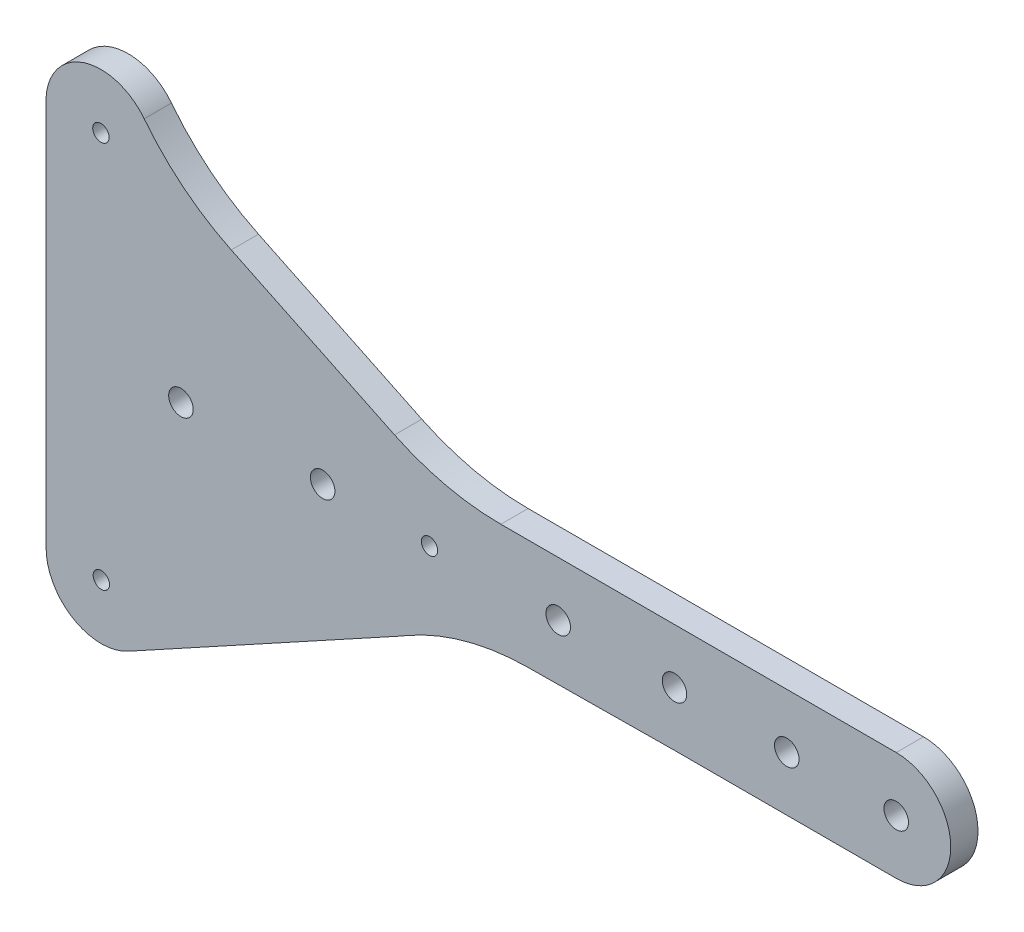
ISO-10303-21;
HEADER;
FILE_DESCRIPTION(('STEP AP214'),'2;1');
FILE_NAME('part.step','',(''),(''),'','','');
FILE_SCHEMA(('AUTOMOTIVE_DESIGN { 1 0 10303 214 1 1 1 1 }'));
ENDSEC;
DATA;
#1=APPLICATION_CONTEXT('core data for automotive mechanical design processes');
#2=APPLICATION_PROTOCOL_DEFINITION('international standard','automotive_design',2000,#1);
#3=PRODUCT_CONTEXT('',#1,'mechanical');
#4=PRODUCT('Part','Part','',(#3));
#5=PRODUCT_RELATED_PRODUCT_CATEGORY('part','',(#4));
#6=PRODUCT_DEFINITION_FORMATION('','',#4);
#7=PRODUCT_DEFINITION_CONTEXT('part definition',#1,'design');
#8=PRODUCT_DEFINITION('design','',#6,#7);
#9=PRODUCT_DEFINITION_SHAPE('','',#8);
#10=(LENGTH_UNIT() NAMED_UNIT(*) SI_UNIT(.MILLI.,.METRE.));
#11=(NAMED_UNIT(*) PLANE_ANGLE_UNIT() SI_UNIT($,.RADIAN.));
#12=(NAMED_UNIT(*) SI_UNIT($,.STERADIAN.) SOLID_ANGLE_UNIT());
#13=UNCERTAINTY_MEASURE_WITH_UNIT(LENGTH_MEASURE(1.E-05),#10,'distance_accuracy_value','');
#14=(GEOMETRIC_REPRESENTATION_CONTEXT(3) GLOBAL_UNCERTAINTY_ASSIGNED_CONTEXT((#13)) GLOBAL_UNIT_ASSIGNED_CONTEXT((#10,
#11,#12)) REPRESENTATION_CONTEXT('',''));
#15=CARTESIAN_POINT('',(0.,0.,0.));
#16=DIRECTION('',(0.,0.,1.));
#17=DIRECTION('',(1.,0.,0.));
#18=AXIS2_PLACEMENT_3D('',#15,#16,#17);
#19=CARTESIAN_POINT('',(15.4,-35.5,5.));
#20=DIRECTION('',(0.,0.,-1.));
#21=DIRECTION('',(-1.,0.,0.));
#22=AXIS2_PLACEMENT_3D('',#19,#20,#21);
#23=CYLINDRICAL_SURFACE('',#22,10.1327105129006);
#24=CARTESIAN_POINT('',(15.4,-35.4999999999999,0.));
#25=DIRECTION('',(0.,0.,-1.));
#26=DIRECTION('',(-1.,0.,0.));
#27=AXIS2_PLACEMENT_3D('',#24,#25,#26);
#28=CIRCLE('',#27,10.1327105129006);
#29=CARTESIAN_POINT('',(20.2700398860927,-44.3856363782293,0.));
#30=VERTEX_POINT('',#29);
#31=CARTESIAN_POINT('',(5.2672894870994,-35.5,0.));
#32=VERTEX_POINT('',#31);
#33=EDGE_CURVE('E176',#30,#32,#28,.T.);
#34=ORIENTED_EDGE('',*,*,#33,.F.);
#35=DIRECTION('',(0.,0.,-1.));
#36=VECTOR('',#35,1.);
#37=CARTESIAN_POINT('',(20.2700398860927,-44.3856363782293,5.));
#38=LINE('',#37,#36);
#39=CARTESIAN_POINT('',(20.2700398860927,-44.3856363782293,5.));
#40=VERTEX_POINT('',#39);
#41=EDGE_CURVE('E13',#40,#30,#38,.T.);
#42=ORIENTED_EDGE('',*,*,#41,.F.);
#43=CARTESIAN_POINT('',(15.4,-35.5,5.));
#44=DIRECTION('',(0.,0.,-1.));
#45=DIRECTION('',(-1.,0.,0.));
#46=AXIS2_PLACEMENT_3D('',#43,#44,#45);
#47=CIRCLE('',#46,10.1327105129006);
#48=CARTESIAN_POINT('',(5.2672894870994,-35.5,5.));
#49=VERTEX_POINT('',#48);
#50=EDGE_CURVE('E212',#40,#49,#47,.T.);
#51=ORIENTED_EDGE('',*,*,#50,.T.);
#52=DIRECTION('',(0.,0.,-1.));
#53=VECTOR('',#52,1.);
#54=CARTESIAN_POINT('',(5.2672894870994,-35.5,5.));
#55=LINE('',#54,#53);
#56=EDGE_CURVE('E51',#49,#32,#55,.T.);
#57=ORIENTED_EDGE('',*,*,#56,.T.);
#58=EDGE_LOOP('',(#34,#42,#51,#57));
#59=FACE_BOUND('',#58,.T.);
#60=ADVANCED_FACE('F48',(#59),#23,.T.);
#61=CARTESIAN_POINT('',(20.2700398860927,-44.3856363782293,5.));
#62=DIRECTION('',(0.48062558186108,-0.876925909105609,0.));
#63=DIRECTION('',(0.876925909105609,0.48062558186108,0.));
#64=AXIS2_PLACEMENT_3D('',#61,#62,#63);
#65=PLANE('',#64);
#66=DIRECTION('',(-0.876925909105609,-0.48062558186108,0.));
#67=VECTOR('',#66,1.);
#68=CARTESIAN_POINT('',(20.2700398860927,-44.3856363782293,0.));
#69=LINE('',#68,#67);
#70=CARTESIAN_POINT('',(70.419428585343,-16.8997577272749,0.));
#71=VERTEX_POINT('',#70);
#72=EDGE_CURVE('E210',#71,#30,#69,.T.);
#73=ORIENTED_EDGE('',*,*,#72,.F.);
#74=DIRECTION('',(0.,0.,-1.));
#75=VECTOR('',#74,1.);
#76=CARTESIAN_POINT('',(70.419428585343,-16.8997577272749,5.));
#77=LINE('',#76,#75);
#78=CARTESIAN_POINT('',(70.419428585343,-16.8997577272749,5.));
#79=VERTEX_POINT('',#78);
#80=EDGE_CURVE('E57',#79,#71,#77,.T.);
#81=ORIENTED_EDGE('',*,*,#80,.F.);
#82=DIRECTION('',(-0.876925909105609,-0.48062558186108,0.));
#83=VECTOR('',#82,1.);
#84=CARTESIAN_POINT('',(20.2700398860927,-44.3856363782293,5.));
#85=LINE('',#84,#83);
#86=EDGE_CURVE('E166',#79,#40,#85,.T.);
#87=ORIENTED_EDGE('',*,*,#86,.T.);
#88=ORIENTED_EDGE('',*,*,#41,.T.);
#89=EDGE_LOOP('',(#73,#81,#87,#88));
#90=FACE_BOUND('',#89,.T.);
#91=ADVANCED_FACE('F236',(#90),#65,.T.);
#92=CARTESIAN_POINT('',(71.3410403775092,-16.3633569679973,4.99999999999999));
#93=DIRECTION('',(0.503026872738356,-0.864270770825365,0.));
#94=DIRECTION('',(0.864270770825365,0.503026872738356,0.));
#95=AXIS2_PLACEMENT_3D('',#92,#93,#94);
#96=PLANE('',#95);
#97=DIRECTION('',(-0.864270770825365,-0.503026872738356,0.));
#98=VECTOR('',#97,1.);
#99=CARTESIAN_POINT('',(71.3410403775092,-16.3633569679973,0.));
#100=LINE('',#99,#98);
#101=CARTESIAN_POINT('',(71.3410403775092,-16.3633569679973,0.));
#102=VERTEX_POINT('',#101);
#103=EDGE_CURVE('E152',#102,#71,#100,.T.);
#104=ORIENTED_EDGE('',*,*,#103,.F.);
#105=DIRECTION('',(0.,0.,-1.));
#106=VECTOR('',#105,1.);
#107=CARTESIAN_POINT('',(71.3410403775092,-16.3633569679973,4.99999999999999));
#108=LINE('',#107,#106);
#109=CARTESIAN_POINT('',(71.3410403775092,-16.3633569679973,4.99999999999999));
#110=VERTEX_POINT('',#109);
#111=EDGE_CURVE('E147',#110,#102,#108,.T.);
#112=ORIENTED_EDGE('',*,*,#111,.F.);
#113=DIRECTION('',(-0.864270770825365,-0.503026872738356,0.));
#114=VECTOR('',#113,1.);
#115=CARTESIAN_POINT('',(71.3410403775092,-16.3633569679973,4.99999999999999));
#116=LINE('',#115,#114);
#117=EDGE_CURVE('E150',#110,#79,#116,.T.);
#118=ORIENTED_EDGE('',*,*,#117,.T.);
#119=ORIENTED_EDGE('',*,*,#80,.T.);
#120=EDGE_LOOP('',(#104,#112,#118,#119));
#121=FACE_BOUND('',#120,.T.);
#122=ADVANCED_FACE('F149',(#121),#96,.T.);
#123=CARTESIAN_POINT('',(93.9772496507354,-55.2555416551387,5.));
#124=DIRECTION('',(0.,0.,-1.));
#125=DIRECTION('',(-1.,0.,0.));
#126=AXIS2_PLACEMENT_3D('',#123,#124,#125);
#127=CYLINDRICAL_SURFACE('',#126,45.);
#128=CARTESIAN_POINT('',(93.9772496507354,-55.2555416551386,0.));
#129=DIRECTION('',(0.,0.,1.));
#130=DIRECTION('',(1.,0.,0.));
#131=AXIS2_PLACEMENT_3D('',#128,#129,#130);
#132=CIRCLE('',#131,45.);
#133=CARTESIAN_POINT('',(93.547882820936,-10.2575901003682,0.));
#134=VERTEX_POINT('',#133);
#135=EDGE_CURVE('E207',#134,#102,#132,.T.);
#136=ORIENTED_EDGE('',*,*,#135,.F.);
#137=DIRECTION('',(0.,0.,-1.));
#138=VECTOR('',#137,1.);
#139=CARTESIAN_POINT('',(93.547882820936,-10.2575901003682,4.99999999999999));
#140=LINE('',#139,#138);
#141=CARTESIAN_POINT('',(93.547882820936,-10.2575901003682,4.99999999999999));
#142=VERTEX_POINT('',#141);
#143=EDGE_CURVE('E157',#142,#134,#140,.T.);
#144=ORIENTED_EDGE('',*,*,#143,.F.);
#145=CARTESIAN_POINT('',(93.9772496507354,-55.2555416551387,5.));
#146=DIRECTION('',(0.,0.,1.));
#147=DIRECTION('',(1.,0.,0.));
#148=AXIS2_PLACEMENT_3D('',#145,#146,#147);
#149=CIRCLE('',#148,45.);
#150=EDGE_CURVE('E164',#142,#110,#149,.T.);
#151=ORIENTED_EDGE('',*,*,#150,.T.);
#152=ORIENTED_EDGE('',*,*,#111,.T.);
#153=EDGE_LOOP('',(#136,#144,#151,#152));
#154=FACE_BOUND('',#153,.T.);
#155=ADVANCED_FACE('F168',(#154),#127,.F.);
#156=CARTESIAN_POINT('',(120.543509993257,-9.99999999999837,5.));
#157=DIRECTION('',(0.00954148510665591,-0.999954478994899,0.));
#158=DIRECTION('',(0.999954478994899,0.00954148510665591,0.));
#159=AXIS2_PLACEMENT_3D('',#156,#157,#158);
#160=PLANE('',#159);
#161=DIRECTION('',(-0.999954478994899,-0.00954148510665591,0.));
#162=VECTOR('',#161,1.);
#163=CARTESIAN_POINT('',(120.543509993257,-9.99999999999837,0.));
#164=LINE('',#163,#162);
#165=CARTESIAN_POINT('',(120.543509993257,-9.99999999999837,0.));
#166=VERTEX_POINT('',#165);
#167=EDGE_CURVE('E204',#166,#134,#164,.T.);
#168=ORIENTED_EDGE('',*,*,#167,.F.);
#169=DIRECTION('',(0.,0.,-1.));
#170=VECTOR('',#169,1.);
#171=CARTESIAN_POINT('',(120.543509993257,-9.99999999999837,5.));
#172=LINE('',#171,#170);
#173=CARTESIAN_POINT('',(120.543509993257,-9.99999999999837,5.));
#174=VERTEX_POINT('',#173);
#175=EDGE_CURVE('E216',#174,#166,#172,.T.);
#176=ORIENTED_EDGE('',*,*,#175,.F.);
#177=DIRECTION('',(-0.999954478994899,-0.00954148510665591,0.));
#178=VECTOR('',#177,1.);
#179=CARTESIAN_POINT('',(120.543509993257,-9.99999999999837,5.));
#180=LINE('',#179,#178);
#181=EDGE_CURVE('E169',#174,#142,#180,.T.);
#182=ORIENTED_EDGE('',*,*,#181,.T.);
#183=ORIENTED_EDGE('',*,*,#143,.T.);
#184=EDGE_LOOP('',(#168,#176,#182,#183));
#185=FACE_BOUND('',#184,.T.);
#186=ADVANCED_FACE('F249',(#185),#160,.T.);
#187=CARTESIAN_POINT('',(120.543509993257,-9.99999999999837,5.));
#188=DIRECTION('',(0.,-1.,0.));
#189=DIRECTION('',(0.,0.,-1.));
#190=AXIS2_PLACEMENT_3D('',#187,#188,#189);
#191=PLANE('',#190);
#192=DIRECTION('',(-1.,0.,0.));
#193=VECTOR('',#192,1.);
#194=CARTESIAN_POINT('',(120.543509993257,-9.99999999999837,0.));
#195=LINE('',#194,#193);
#196=CARTESIAN_POINT('',(161.221070033097,-9.99999999999837,0.));
#197=VERTEX_POINT('',#196);
#198=EDGE_CURVE('E201',#197,#166,#195,.T.);
#199=ORIENTED_EDGE('',*,*,#198,.F.);
#200=DIRECTION('',(0.,0.,-1.));
#201=VECTOR('',#200,1.);
#202=CARTESIAN_POINT('',(161.221070033097,-9.9999999999984,5.));
#203=LINE('',#202,#201);
#204=CARTESIAN_POINT('',(161.221070033097,-9.9999999999984,5.));
#205=VERTEX_POINT('',#204);
#206=EDGE_CURVE('E218',#205,#197,#203,.T.);
#207=ORIENTED_EDGE('',*,*,#206,.F.);
#208=DIRECTION('',(-1.,0.,0.));
#209=VECTOR('',#208,1.);
#210=CARTESIAN_POINT('',(120.543509993257,-9.99999999999837,5.));
#211=LINE('',#210,#209);
#212=EDGE_CURVE('E171',#205,#174,#211,.T.);
#213=ORIENTED_EDGE('',*,*,#212,.T.);
#214=ORIENTED_EDGE('',*,*,#175,.T.);
#215=EDGE_LOOP('',(#199,#207,#213,#214));
#216=FACE_BOUND('',#215,.T.);
#217=ADVANCED_FACE('F252',(#216),#191,.T.);
#218=CARTESIAN_POINT('',(161.221070033097,1.18394877235417E-12,5.));
#219=DIRECTION('',(0.,0.,-1.));
#220=DIRECTION('',(-1.,0.,0.));
#221=AXIS2_PLACEMENT_3D('',#218,#219,#220);
#222=CYLINDRICAL_SURFACE('',#221,9.99999999999956);
#223=CARTESIAN_POINT('',(161.221070033097,1.18264772974719E-12,0.));
#224=DIRECTION('',(0.,0.,-1.));
#225=DIRECTION('',(-1.,0.,0.));
#226=AXIS2_PLACEMENT_3D('',#223,#224,#225);
#227=CIRCLE('',#226,9.99999999999956);
#228=CARTESIAN_POINT('',(161.221070033097,10.0000000000007,0.));
#229=VERTEX_POINT('',#228);
#230=EDGE_CURVE('E198',#229,#197,#227,.T.);
#231=ORIENTED_EDGE('',*,*,#230,.F.);
#232=DIRECTION('',(0.,0.,-1.));
#233=VECTOR('',#232,1.);
#234=CARTESIAN_POINT('',(161.221070033097,10.0000000000007,4.99999999999998));
#235=LINE('',#234,#233);
#236=CARTESIAN_POINT('',(161.221070033097,10.0000000000007,4.99999999999998));
#237=VERTEX_POINT('',#236);
#238=EDGE_CURVE('E220',#237,#229,#235,.T.);
#239=ORIENTED_EDGE('',*,*,#238,.F.);
#240=CARTESIAN_POINT('',(161.221070033097,1.18394877235417E-12,5.));
#241=DIRECTION('',(0.,0.,-1.));
#242=DIRECTION('',(-1.,0.,0.));
#243=AXIS2_PLACEMENT_3D('',#240,#241,#242);
#244=CIRCLE('',#243,9.99999999999956);
#245=EDGE_CURVE('E403',#237,#205,#244,.T.);
#246=ORIENTED_EDGE('',*,*,#245,.T.);
#247=ORIENTED_EDGE('',*,*,#206,.T.);
#248=EDGE_LOOP('',(#231,#239,#246,#247));
#249=FACE_BOUND('',#248,.T.);
#250=ADVANCED_FACE('F256',(#249),#222,.T.);
#251=CARTESIAN_POINT('',(120.543509993257,10.0000000000007,4.99999999999998));
#252=DIRECTION('',(0.,1.,0.));
#253=DIRECTION('',(0.,0.,1.));
#254=AXIS2_PLACEMENT_3D('',#251,#252,#253);
#255=PLANE('',#254);
#256=DIRECTION('',(1.,0.,0.));
#257=VECTOR('',#256,1.);
#258=CARTESIAN_POINT('',(120.543509993257,10.0000000000007,0.));
#259=LINE('',#258,#257);
#260=CARTESIAN_POINT('',(88.6858525505972,10.0000000000007,0.));
#261=VERTEX_POINT('',#260);
#262=EDGE_CURVE('E195',#261,#229,#259,.T.);
#263=ORIENTED_EDGE('',*,*,#262,.F.);
#264=DIRECTION('',(0.,0.,-1.));
#265=VECTOR('',#264,1.);
#266=CARTESIAN_POINT('',(88.6858525505972,10.0000000000007,4.99999999999998));
#267=LINE('',#266,#265);
#268=CARTESIAN_POINT('',(88.6858525505972,10.0000000000007,4.99999999999998));
#269=VERTEX_POINT('',#268);
#270=EDGE_CURVE('E222',#269,#261,#267,.T.);
#271=ORIENTED_EDGE('',*,*,#270,.F.);
#272=DIRECTION('',(1.,0.,0.));
#273=VECTOR('',#272,1.);
#274=CARTESIAN_POINT('',(88.6858525505972,10.0000000000007,4.99999999999998));
#275=LINE('',#274,#273);
#276=EDGE_CURVE('E401',#269,#237,#275,.T.);
#277=ORIENTED_EDGE('',*,*,#276,.T.);
#278=ORIENTED_EDGE('',*,*,#238,.T.);
#279=EDGE_LOOP('',(#263,#271,#277,#278));
#280=FACE_BOUND('',#279,.T.);
#281=ADVANCED_FACE('F260',(#280),#255,.T.);
#282=CARTESIAN_POINT('',(88.685852550597,55.0000000000007,5.));
#283=DIRECTION('',(0.,0.,-1.));
#284=DIRECTION('',(-1.,0.,0.));
#285=AXIS2_PLACEMENT_3D('',#282,#283,#284);
#286=CYLINDRICAL_SURFACE('',#285,45.);
#287=CARTESIAN_POINT('',(88.685852550597,55.0000000000008,0.));
#288=DIRECTION('',(0.,0.,1.));
#289=DIRECTION('',(1.,0.,0.));
#290=AXIS2_PLACEMENT_3D('',#287,#288,#289);
#291=CIRCLE('',#290,45.);
#292=CARTESIAN_POINT('',(69.1842635861553,14.4452465441854,0.));
#293=VERTEX_POINT('',#292);
#294=EDGE_CURVE('E192',#293,#261,#291,.T.);
#295=ORIENTED_EDGE('',*,*,#294,.F.);
#296=DIRECTION('',(0.,0.,-1.));
#297=VECTOR('',#296,1.);
#298=CARTESIAN_POINT('',(69.1842635861553,14.4452465441854,5.));
#299=LINE('',#298,#297);
#300=CARTESIAN_POINT('',(69.1842635861553,14.4452465441854,5.));
#301=VERTEX_POINT('',#300);
#302=EDGE_CURVE('E225',#301,#293,#299,.T.);
#303=ORIENTED_EDGE('',*,*,#302,.F.);
#304=CARTESIAN_POINT('',(88.685852550597,55.0000000000007,5.));
#305=DIRECTION('',(0.,0.,1.));
#306=DIRECTION('',(1.,0.,0.));
#307=AXIS2_PLACEMENT_3D('',#304,#305,#306);
#308=CIRCLE('',#307,45.);
#309=EDGE_CURVE('E398',#301,#269,#308,.T.);
#310=ORIENTED_EDGE('',*,*,#309,.T.);
#311=ORIENTED_EDGE('',*,*,#270,.T.);
#312=EDGE_LOOP('',(#295,#303,#310,#311));
#313=FACE_BOUND('',#312,.T.);
#314=ADVANCED_FACE('F264',(#313),#286,.F.);
#315=CARTESIAN_POINT('',(39.2255189041701,28.8515263238237,5.));
#316=DIRECTION('',(0.433368643654258,0.901216743462564,0.));
#317=DIRECTION('',(-0.901216743462564,0.433368643654258,0.));
#318=AXIS2_PLACEMENT_3D('',#315,#316,#317);
#319=PLANE('',#318);
#320=DIRECTION('',(0.901216743462564,-0.433368643654258,0.));
#321=VECTOR('',#320,1.);
#322=CARTESIAN_POINT('',(39.2255189041701,28.8515263238237,0.));
#323=LINE('',#322,#321);
#324=CARTESIAN_POINT('',(39.2255189041701,28.8515263238237,0.));
#325=VERTEX_POINT('',#324);
#326=EDGE_CURVE('E189',#325,#293,#323,.T.);
#327=ORIENTED_EDGE('',*,*,#326,.F.);
#328=DIRECTION('',(0.,0.,-1.));
#329=VECTOR('',#328,1.);
#330=CARTESIAN_POINT('',(39.2255189041701,28.8515263238237,5.));
#331=LINE('',#330,#329);
#332=CARTESIAN_POINT('',(39.2255189041701,28.8515263238237,5.));
#333=VERTEX_POINT('',#332);
#334=EDGE_CURVE('E227',#333,#325,#331,.T.);
#335=ORIENTED_EDGE('',*,*,#334,.F.);
#336=DIRECTION('',(0.901216743462564,-0.433368643654258,0.));
#337=VECTOR('',#336,1.);
#338=CARTESIAN_POINT('',(39.2255189041701,28.8515263238237,5.));
#339=LINE('',#338,#337);
#340=EDGE_CURVE('E395',#333,#301,#339,.T.);
#341=ORIENTED_EDGE('',*,*,#340,.T.);
#342=ORIENTED_EDGE('',*,*,#302,.T.);
#343=EDGE_LOOP('',(#327,#335,#341,#342));
#344=FACE_BOUND('',#343,.T.);
#345=ADVANCED_FACE('F268',(#344),#319,.T.);
#346=CARTESIAN_POINT('',(58.7271078686117,69.406279779639,5.));
#347=DIRECTION('',(0.,0.,-1.));
#348=DIRECTION('',(-1.,0.,0.));
#349=AXIS2_PLACEMENT_3D('',#346,#347,#348);
#350=CYLINDRICAL_SURFACE('',#349,45.);
#351=CARTESIAN_POINT('',(58.7271078686117,69.406279779639,0.));
#352=DIRECTION('',(0.,0.,1.));
#353=DIRECTION('',(1.,0.,0.));
#354=AXIS2_PLACEMENT_3D('',#351,#352,#353);
#355=CIRCLE('',#354,45.);
#356=CARTESIAN_POINT('',(23.263165727236,41.7059402908682,0.));
#357=VERTEX_POINT('',#356);
#358=EDGE_CURVE('E186',#357,#325,#355,.T.);
#359=ORIENTED_EDGE('',*,*,#358,.F.);
#360=DIRECTION('',(0.,0.,-1.));
#361=VECTOR('',#360,1.);
#362=CARTESIAN_POINT('',(23.263165727236,41.7059402908682,4.99999999999998));
#363=LINE('',#362,#361);
#364=CARTESIAN_POINT('',(23.263165727236,41.7059402908682,4.99999999999998));
#365=VERTEX_POINT('',#364);
#366=EDGE_CURVE('E229',#365,#357,#363,.T.);
#367=ORIENTED_EDGE('',*,*,#366,.F.);
#368=CARTESIAN_POINT('',(58.7271078686117,69.406279779639,5.));
#369=DIRECTION('',(0.,0.,1.));
#370=DIRECTION('',(1.,0.,0.));
#371=AXIS2_PLACEMENT_3D('',#368,#369,#370);
#372=CIRCLE('',#371,45.);
#373=EDGE_CURVE('E392',#365,#333,#372,.T.);
#374=ORIENTED_EDGE('',*,*,#373,.T.);
#375=ORIENTED_EDGE('',*,*,#334,.T.);
#376=EDGE_LOOP('',(#359,#367,#374,#375));
#377=FACE_BOUND('',#376,.T.);
#378=ADVANCED_FACE('F272',(#377),#350,.F.);
#379=CARTESIAN_POINT('',(15.3178801650355,35.5,5.));
#380=DIRECTION('',(0.,0.,-1.));
#381=DIRECTION('',(-1.,0.,0.));
#382=AXIS2_PLACEMENT_3D('',#379,#380,#381);
#383=CYLINDRICAL_SURFACE('',#382,10.0817288973039);
#384=CARTESIAN_POINT('',(15.3178801650355,35.5000000000001,0.));
#385=DIRECTION('',(0.,0.,-1.));
#386=DIRECTION('',(-1.,0.,0.));
#387=AXIS2_PLACEMENT_3D('',#384,#385,#386);
#388=CIRCLE('',#387,10.0817288973039);
#389=CARTESIAN_POINT('',(5.26728948709938,34.7082395669676,0.));
#390=VERTEX_POINT('',#389);
#391=EDGE_CURVE('E183',#390,#357,#388,.T.);
#392=ORIENTED_EDGE('',*,*,#391,.F.);
#393=DIRECTION('',(0.,0.,-1.));
#394=VECTOR('',#393,1.);
#395=CARTESIAN_POINT('',(5.26728948709938,34.7082395669676,5.));
#396=LINE('',#395,#394);
#397=CARTESIAN_POINT('',(5.26728948709938,34.7082395669676,5.));
#398=VERTEX_POINT('',#397);
#399=EDGE_CURVE('E230',#398,#390,#396,.T.);
#400=ORIENTED_EDGE('',*,*,#399,.F.);
#401=CARTESIAN_POINT('',(15.3178801650355,35.5,5.));
#402=DIRECTION('',(0.,0.,-1.));
#403=DIRECTION('',(-1.,0.,0.));
#404=AXIS2_PLACEMENT_3D('',#401,#402,#403);
#405=CIRCLE('',#404,10.0817288973039);
#406=EDGE_CURVE('E389',#398,#365,#405,.T.);
#407=ORIENTED_EDGE('',*,*,#406,.T.);
#408=ORIENTED_EDGE('',*,*,#366,.T.);
#409=EDGE_LOOP('',(#392,#400,#407,#408));
#410=FACE_BOUND('',#409,.T.);
#411=ADVANCED_FACE('F276',(#410),#383,.T.);
#412=CARTESIAN_POINT('',(5.2672894870994,-35.5,5.));
#413=DIRECTION('',(-1.,0.,0.));
#414=DIRECTION('',(0.,0.,1.));
#415=AXIS2_PLACEMENT_3D('',#412,#413,#414);
#416=PLANE('',#415);
#417=DIRECTION('',(0.,1.,0.));
#418=VECTOR('',#417,1.);
#419=CARTESIAN_POINT('',(5.2672894870994,-35.5,0.));
#420=LINE('',#419,#418);
#421=EDGE_CURVE('E179',#32,#390,#420,.T.);
#422=ORIENTED_EDGE('',*,*,#421,.F.);
#423=ORIENTED_EDGE('',*,*,#56,.F.);
#424=DIRECTION('',(0.,1.,0.));
#425=VECTOR('',#424,1.);
#426=CARTESIAN_POINT('',(5.2672894870994,-35.5,5.));
#427=LINE('',#426,#425);
#428=EDGE_CURVE('E387',#49,#398,#427,.T.);
#429=ORIENTED_EDGE('',*,*,#428,.T.);
#430=ORIENTED_EDGE('',*,*,#399,.T.);
#431=EDGE_LOOP('',(#422,#423,#429,#430));
#432=FACE_BOUND('',#431,.T.);
#433=ADVANCED_FACE('F232',(#432),#416,.T.);
#434=CARTESIAN_POINT('',(15.4,-35.5,5.));
#435=DIRECTION('',(0.,0.,-1.));
#436=DIRECTION('',(-1.,0.,0.));
#437=AXIS2_PLACEMENT_3D('',#434,#435,#436);
#438=PLANE('',#437);
#439=CARTESIAN_POINT('',(120.543509993257,1.18264772974719E-12,5.));
#440=DIRECTION('',(0.,0.,-1.));
#441=DIRECTION('',(1.,0.,0.));
#442=AXIS2_PLACEMENT_3D('',#439,#440,#441);
#443=CIRCLE('',#442,2.25);
#444=CARTESIAN_POINT('',(122.793509993257,1.18264772974719E-12,5.));
#445=VERTEX_POINT('',#444);
#446=EDGE_CURVE('E347',#445,#445,#443,.T.);
#447=ORIENTED_EDGE('',*,*,#446,.T.);
#448=EDGE_LOOP('',(#447));
#449=FACE_BOUND('',#448,.T.);
#450=CARTESIAN_POINT('',(99.2100662171657,0.,5.));
#451=DIRECTION('',(0.,0.,-1.));
#452=DIRECTION('',(1.,0.,0.));
#453=AXIS2_PLACEMENT_3D('',#450,#451,#452);
#454=CIRCLE('',#453,2.25000000000034);
#455=CARTESIAN_POINT('',(101.460066217166,0.,5.));
#456=VERTEX_POINT('',#455);
#457=EDGE_CURVE('E352',#456,#456,#454,.T.);
#458=ORIENTED_EDGE('',*,*,#457,.T.);
#459=EDGE_LOOP('',(#458));
#460=FACE_BOUND('',#459,.T.);
#461=CARTESIAN_POINT('',(75.6,0.,5.));
#462=DIRECTION('',(0.,0.,-1.));
#463=DIRECTION('',(1.,0.,0.));
#464=AXIS2_PLACEMENT_3D('',#461,#462,#463);
#465=CIRCLE('',#464,1.50000000000034);
#466=CARTESIAN_POINT('',(77.1000000000004,0.,5.));
#467=VERTEX_POINT('',#466);
#468=EDGE_CURVE('E358',#467,#467,#465,.T.);
#469=ORIENTED_EDGE('',*,*,#468,.T.);
#470=EDGE_LOOP('',(#469));
#471=FACE_BOUND('',#470,.T.);
#472=CARTESIAN_POINT('',(161.221070033097,1.18394877235417E-12,5.));
#473=DIRECTION('',(0.,0.,-1.));
#474=DIRECTION('',(1.,0.,0.));
#475=AXIS2_PLACEMENT_3D('',#472,#473,#474);
#476=CIRCLE('',#475,2.25000000000001);
#477=CARTESIAN_POINT('',(163.471070033097,1.18394877235417E-12,5.));
#478=VERTEX_POINT('',#477);
#479=EDGE_CURVE('E364',#478,#478,#476,.T.);
#480=ORIENTED_EDGE('',*,*,#479,.T.);
#481=EDGE_LOOP('',(#480));
#482=FACE_BOUND('',#481,.T.);
#483=CARTESIAN_POINT('',(141.143801149636,1.18394877235417E-12,5.));
#484=DIRECTION('',(0.,0.,-1.));
#485=DIRECTION('',(1.,0.,0.));
#486=AXIS2_PLACEMENT_3D('',#483,#484,#485);
#487=CIRCLE('',#486,2.25000000000001);
#488=CARTESIAN_POINT('',(143.393801149636,1.18394877235417E-12,5.));
#489=VERTEX_POINT('',#488);
#490=EDGE_CURVE('E370',#489,#489,#487,.T.);
#491=ORIENTED_EDGE('',*,*,#490,.T.);
#492=EDGE_LOOP('',(#491));
#493=FACE_BOUND('',#492,.T.);
#494=CARTESIAN_POINT('',(56.,0.,5.));
#495=DIRECTION('',(0.,0.,-1.));
#496=DIRECTION('',(1.,0.,0.));
#497=AXIS2_PLACEMENT_3D('',#494,#495,#496);
#498=CIRCLE('',#497,2.25);
#499=CARTESIAN_POINT('',(58.25,0.,5.));
#500=VERTEX_POINT('',#499);
#501=EDGE_CURVE('E376',#500,#500,#498,.T.);
#502=ORIENTED_EDGE('',*,*,#501,.T.);
#503=EDGE_LOOP('',(#502));
#504=FACE_BOUND('',#503,.T.);
#505=CARTESIAN_POINT('',(30.,0.,5.));
#506=DIRECTION('',(0.,0.,-1.));
#507=DIRECTION('',(1.,0.,0.));
#508=AXIS2_PLACEMENT_3D('',#505,#506,#507);
#509=CIRCLE('',#508,2.25);
#510=CARTESIAN_POINT('',(32.25,0.,5.));
#511=VERTEX_POINT('',#510);
#512=EDGE_CURVE('E180',#511,#511,#509,.T.);
#513=ORIENTED_EDGE('',*,*,#512,.T.);
#514=EDGE_LOOP('',(#513));
#515=FACE_BOUND('',#514,.T.);
#516=ORIENTED_EDGE('',*,*,#50,.F.);
#517=ORIENTED_EDGE('',*,*,#86,.F.);
#518=ORIENTED_EDGE('',*,*,#117,.F.);
#519=ORIENTED_EDGE('',*,*,#150,.F.);
#520=ORIENTED_EDGE('',*,*,#181,.F.);
#521=ORIENTED_EDGE('',*,*,#212,.F.);
#522=ORIENTED_EDGE('',*,*,#245,.F.);
#523=ORIENTED_EDGE('',*,*,#276,.F.);
#524=ORIENTED_EDGE('',*,*,#309,.F.);
#525=ORIENTED_EDGE('',*,*,#340,.F.);
#526=ORIENTED_EDGE('',*,*,#373,.F.);
#527=ORIENTED_EDGE('',*,*,#406,.F.);
#528=ORIENTED_EDGE('',*,*,#428,.F.);
#529=EDGE_LOOP('',(#516,#517,#518,#519,#520,#521,#522,#523,#524,#525,#526,#527,#528));
#530=FACE_BOUND('',#529,.T.);
#531=CARTESIAN_POINT('',(15.4,-35.5,5.));
#532=DIRECTION('',(0.,0.,1.));
#533=DIRECTION('',(1.,0.,0.));
#534=AXIS2_PLACEMENT_3D('',#531,#532,#533);
#535=CIRCLE('',#534,1.5);
#536=CARTESIAN_POINT('',(16.9,-35.5,5.));
#537=VERTEX_POINT('',#536);
#538=EDGE_CURVE('E337',#537,#537,#535,.T.);
#539=ORIENTED_EDGE('',*,*,#538,.F.);
#540=EDGE_LOOP('',(#539));
#541=FACE_BOUND('',#540,.T.);
#542=CARTESIAN_POINT('',(15.3178801650355,35.5,5.));
#543=DIRECTION('',(0.,0.,1.));
#544=DIRECTION('',(1.,0.,0.));
#545=AXIS2_PLACEMENT_3D('',#542,#543,#544);
#546=CIRCLE('',#545,1.5);
#547=CARTESIAN_POINT('',(16.8178801650355,35.5,5.));
#548=VERTEX_POINT('',#547);
#549=EDGE_CURVE('E332',#548,#548,#546,.T.);
#550=ORIENTED_EDGE('',*,*,#549,.F.);
#551=EDGE_LOOP('',(#550));
#552=FACE_BOUND('',#551,.T.);
#553=ADVANCED_FACE('F161',(#449,#460,#471,#482,#493,#504,#515,#530,#541,#552),#438,.F.);
#554=CARTESIAN_POINT('',(15.4,-35.4999999999999,0.));
#555=DIRECTION('',(0.,0.,-1.));
#556=DIRECTION('',(-1.,0.,0.));
#557=AXIS2_PLACEMENT_3D('',#554,#555,#556);
#558=PLANE('',#557);
#559=CARTESIAN_POINT('',(120.543509993257,1.18134668714021E-12,0.));
#560=DIRECTION('',(0.,0.,-1.));
#561=DIRECTION('',(1.,0.,0.));
#562=AXIS2_PLACEMENT_3D('',#559,#560,#561);
#563=CIRCLE('',#562,2.25);
#564=CARTESIAN_POINT('',(122.793509993257,1.18134668714021E-12,0.));
#565=VERTEX_POINT('',#564);
#566=EDGE_CURVE('E346',#565,#565,#563,.T.);
#567=ORIENTED_EDGE('',*,*,#566,.F.);
#568=EDGE_LOOP('',(#567));
#569=FACE_BOUND('',#568,.T.);
#570=CARTESIAN_POINT('',(99.2100662171657,0.,0.));
#571=DIRECTION('',(0.,0.,-1.));
#572=DIRECTION('',(1.,0.,0.));
#573=AXIS2_PLACEMENT_3D('',#570,#571,#572);
#574=CIRCLE('',#573,2.25000000000034);
#575=CARTESIAN_POINT('',(101.460066217166,0.,0.));
#576=VERTEX_POINT('',#575);
#577=EDGE_CURVE('E349',#576,#576,#574,.T.);
#578=ORIENTED_EDGE('',*,*,#577,.F.);
#579=EDGE_LOOP('',(#578));
#580=FACE_BOUND('',#579,.T.);
#581=CARTESIAN_POINT('',(75.6,0.,0.));
#582=DIRECTION('',(0.,0.,-1.));
#583=DIRECTION('',(1.,0.,0.));
#584=AXIS2_PLACEMENT_3D('',#581,#582,#583);
#585=CIRCLE('',#584,1.50000000000034);
#586=CARTESIAN_POINT('',(77.1000000000004,0.,0.));
#587=VERTEX_POINT('',#586);
#588=EDGE_CURVE('E355',#587,#587,#585,.T.);
#589=ORIENTED_EDGE('',*,*,#588,.F.);
#590=EDGE_LOOP('',(#589));
#591=FACE_BOUND('',#590,.T.);
#592=CARTESIAN_POINT('',(161.221070033097,1.18264772974719E-12,0.));
#593=DIRECTION('',(0.,0.,-1.));
#594=DIRECTION('',(1.,0.,0.));
#595=AXIS2_PLACEMENT_3D('',#592,#593,#594);
#596=CIRCLE('',#595,2.25000000000001);
#597=CARTESIAN_POINT('',(163.471070033097,1.18264772974719E-12,0.));
#598=VERTEX_POINT('',#597);
#599=EDGE_CURVE('E361',#598,#598,#596,.T.);
#600=ORIENTED_EDGE('',*,*,#599,.F.);
#601=EDGE_LOOP('',(#600));
#602=FACE_BOUND('',#601,.T.);
#603=CARTESIAN_POINT('',(141.143801149636,1.18264772974719E-12,0.));
#604=DIRECTION('',(0.,0.,-1.));
#605=DIRECTION('',(1.,0.,0.));
#606=AXIS2_PLACEMENT_3D('',#603,#604,#605);
#607=CIRCLE('',#606,2.25000000000001);
#608=CARTESIAN_POINT('',(143.393801149636,1.18264772974719E-12,0.));
#609=VERTEX_POINT('',#608);
#610=EDGE_CURVE('E367',#609,#609,#607,.T.);
#611=ORIENTED_EDGE('',*,*,#610,.F.);
#612=EDGE_LOOP('',(#611));
#613=FACE_BOUND('',#612,.T.);
#614=CARTESIAN_POINT('',(56.,0.,0.));
#615=DIRECTION('',(0.,0.,-1.));
#616=DIRECTION('',(1.,0.,0.));
#617=AXIS2_PLACEMENT_3D('',#614,#615,#616);
#618=CIRCLE('',#617,2.25);
#619=CARTESIAN_POINT('',(58.25,0.,0.));
#620=VERTEX_POINT('',#619);
#621=EDGE_CURVE('E373',#620,#620,#618,.T.);
#622=ORIENTED_EDGE('',*,*,#621,.F.);
#623=EDGE_LOOP('',(#622));
#624=FACE_BOUND('',#623,.T.);
#625=CARTESIAN_POINT('',(30.,0.,0.));
#626=DIRECTION('',(0.,0.,-1.));
#627=DIRECTION('',(1.,0.,0.));
#628=AXIS2_PLACEMENT_3D('',#625,#626,#627);
#629=CIRCLE('',#628,2.25);
#630=CARTESIAN_POINT('',(32.25,0.,0.));
#631=VERTEX_POINT('',#630);
#632=EDGE_CURVE('E379',#631,#631,#629,.T.);
#633=ORIENTED_EDGE('',*,*,#632,.F.);
#634=EDGE_LOOP('',(#633));
#635=FACE_BOUND('',#634,.T.);
#636=ORIENTED_EDGE('',*,*,#33,.T.);
#637=ORIENTED_EDGE('',*,*,#421,.T.);
#638=ORIENTED_EDGE('',*,*,#391,.T.);
#639=ORIENTED_EDGE('',*,*,#358,.T.);
#640=ORIENTED_EDGE('',*,*,#326,.T.);
#641=ORIENTED_EDGE('',*,*,#294,.T.);
#642=ORIENTED_EDGE('',*,*,#262,.T.);
#643=ORIENTED_EDGE('',*,*,#230,.T.);
#644=ORIENTED_EDGE('',*,*,#198,.T.);
#645=ORIENTED_EDGE('',*,*,#167,.T.);
#646=ORIENTED_EDGE('',*,*,#135,.T.);
#647=ORIENTED_EDGE('',*,*,#103,.T.);
#648=ORIENTED_EDGE('',*,*,#72,.T.);
#649=EDGE_LOOP('',(#636,#637,#638,#639,#640,#641,#642,#643,#644,#645,#646,#647,#648));
#650=FACE_BOUND('',#649,.T.);
#651=CARTESIAN_POINT('',(15.4,-35.4999999999999,0.));
#652=DIRECTION('',(0.,0.,-1.));
#653=DIRECTION('',(-1.,0.,0.));
#654=AXIS2_PLACEMENT_3D('',#651,#652,#653);
#655=CIRCLE('',#654,1.5);
#656=CARTESIAN_POINT('',(16.9,-35.5,0.));
#657=VERTEX_POINT('',#656);
#658=EDGE_CURVE('E340',#657,#657,#655,.F.);
#659=ORIENTED_EDGE('',*,*,#658,.T.);
#660=EDGE_LOOP('',(#659));
#661=FACE_BOUND('',#660,.T.);
#662=CARTESIAN_POINT('',(15.3178801650355,35.5000000000001,0.));
#663=DIRECTION('',(0.,0.,-1.));
#664=DIRECTION('',(-1.,0.,0.));
#665=AXIS2_PLACEMENT_3D('',#662,#663,#664);
#666=CIRCLE('',#665,1.5);
#667=CARTESIAN_POINT('',(16.8178801650355,35.5,0.));
#668=VERTEX_POINT('',#667);
#669=EDGE_CURVE('E335',#668,#668,#666,.F.);
#670=ORIENTED_EDGE('',*,*,#669,.T.);
#671=EDGE_LOOP('',(#670));
#672=FACE_BOUND('',#671,.T.);
#673=ADVANCED_FACE('F234',(#569,#580,#591,#602,#613,#624,#635,#650,#661,#672),#558,.T.);
#674=CARTESIAN_POINT('',(30.,0.,5.));
#675=DIRECTION('',(0.,0.,-1.));
#676=DIRECTION('',(-1.,0.,0.));
#677=AXIS2_PLACEMENT_3D('',#674,#675,#676);
#678=CYLINDRICAL_SURFACE('',#677,2.25);
#679=ORIENTED_EDGE('',*,*,#512,.F.);
#680=EDGE_LOOP('',(#679));
#681=FACE_BOUND('',#680,.T.);
#682=ORIENTED_EDGE('',*,*,#632,.T.);
#683=EDGE_LOOP('',(#682));
#684=FACE_BOUND('',#683,.T.);
#685=ADVANCED_FACE('F288',(#681,#684),#678,.F.);
#686=CARTESIAN_POINT('',(56.,0.,5.));
#687=DIRECTION('',(0.,0.,-1.));
#688=DIRECTION('',(-1.,0.,0.));
#689=AXIS2_PLACEMENT_3D('',#686,#687,#688);
#690=CYLINDRICAL_SURFACE('',#689,2.25);
#691=ORIENTED_EDGE('',*,*,#501,.F.);
#692=EDGE_LOOP('',(#691));
#693=FACE_BOUND('',#692,.T.);
#694=ORIENTED_EDGE('',*,*,#621,.T.);
#695=EDGE_LOOP('',(#694));
#696=FACE_BOUND('',#695,.T.);
#697=ADVANCED_FACE('F295',(#693,#696),#690,.F.);
#698=CARTESIAN_POINT('',(141.143801149636,1.18394877235417E-12,5.));
#699=DIRECTION('',(0.,0.,-1.));
#700=DIRECTION('',(-1.,0.,0.));
#701=AXIS2_PLACEMENT_3D('',#698,#699,#700);
#702=CYLINDRICAL_SURFACE('',#701,2.25000000000001);
#703=ORIENTED_EDGE('',*,*,#490,.F.);
#704=EDGE_LOOP('',(#703));
#705=FACE_BOUND('',#704,.T.);
#706=ORIENTED_EDGE('',*,*,#610,.T.);
#707=EDGE_LOOP('',(#706));
#708=FACE_BOUND('',#707,.T.);
#709=ADVANCED_FACE('F299',(#705,#708),#702,.F.);
#710=CARTESIAN_POINT('',(161.221070033097,1.18394877235417E-12,5.));
#711=DIRECTION('',(0.,0.,-1.));
#712=DIRECTION('',(-1.,0.,0.));
#713=AXIS2_PLACEMENT_3D('',#710,#711,#712);
#714=CYLINDRICAL_SURFACE('',#713,2.25000000000001);
#715=ORIENTED_EDGE('',*,*,#479,.F.);
#716=EDGE_LOOP('',(#715));
#717=FACE_BOUND('',#716,.T.);
#718=ORIENTED_EDGE('',*,*,#599,.T.);
#719=EDGE_LOOP('',(#718));
#720=FACE_BOUND('',#719,.T.);
#721=ADVANCED_FACE('F303',(#717,#720),#714,.F.);
#722=CARTESIAN_POINT('',(75.6,0.,5.));
#723=DIRECTION('',(0.,0.,-1.));
#724=DIRECTION('',(-1.,0.,0.));
#725=AXIS2_PLACEMENT_3D('',#722,#723,#724);
#726=CYLINDRICAL_SURFACE('',#725,1.50000000000034);
#727=ORIENTED_EDGE('',*,*,#468,.F.);
#728=EDGE_LOOP('',(#727));
#729=FACE_BOUND('',#728,.T.);
#730=ORIENTED_EDGE('',*,*,#588,.T.);
#731=EDGE_LOOP('',(#730));
#732=FACE_BOUND('',#731,.T.);
#733=ADVANCED_FACE('F307',(#729,#732),#726,.F.);
#734=CARTESIAN_POINT('',(99.2100662171657,0.,5.));
#735=DIRECTION('',(0.,0.,-1.));
#736=DIRECTION('',(-1.,0.,0.));
#737=AXIS2_PLACEMENT_3D('',#734,#735,#736);
#738=CYLINDRICAL_SURFACE('',#737,2.25000000000034);
#739=ORIENTED_EDGE('',*,*,#457,.F.);
#740=EDGE_LOOP('',(#739));
#741=FACE_BOUND('',#740,.T.);
#742=ORIENTED_EDGE('',*,*,#577,.T.);
#743=EDGE_LOOP('',(#742));
#744=FACE_BOUND('',#743,.T.);
#745=ADVANCED_FACE('F311',(#741,#744),#738,.F.);
#746=CARTESIAN_POINT('',(120.543509993257,1.18264772974719E-12,5.));
#747=DIRECTION('',(0.,0.,-1.));
#748=DIRECTION('',(-1.,0.,0.));
#749=AXIS2_PLACEMENT_3D('',#746,#747,#748);
#750=CYLINDRICAL_SURFACE('',#749,2.25);
#751=ORIENTED_EDGE('',*,*,#446,.F.);
#752=EDGE_LOOP('',(#751));
#753=FACE_BOUND('',#752,.T.);
#754=ORIENTED_EDGE('',*,*,#566,.T.);
#755=EDGE_LOOP('',(#754));
#756=FACE_BOUND('',#755,.T.);
#757=ADVANCED_FACE('F315',(#753,#756),#750,.F.);
#758=CARTESIAN_POINT('',(15.4,-35.5,-7.2124891681028));
#759=DIRECTION('',(0.,0.,1.));
#760=DIRECTION('',(1.,0.,0.));
#761=AXIS2_PLACEMENT_3D('',#758,#759,#760);
#762=CYLINDRICAL_SURFACE('',#761,1.5);
#763=CARTESIAN_POINT('',(16.9,-35.5,5.));
#764=CARTESIAN_POINT('',(16.9,-35.5,4.94791666666666));
#765=CARTESIAN_POINT('',(16.9,-35.5,4.89583333333333));
#766=CARTESIAN_POINT('',(16.9,-35.5,4.79166666666666));
#767=CARTESIAN_POINT('',(16.9,-35.5,4.73958333333333));
#768=CARTESIAN_POINT('',(16.9,-35.5,4.63541666666666));
#769=CARTESIAN_POINT('',(16.9,-35.5,4.58333333333333));
#770=CARTESIAN_POINT('',(16.9,-35.5,4.47916666666666));
#771=CARTESIAN_POINT('',(16.9,-35.5,4.42708333333333));
#772=CARTESIAN_POINT('',(16.9,-35.5,4.32291666666666));
#773=CARTESIAN_POINT('',(16.9,-35.5,4.27083333333333));
#774=CARTESIAN_POINT('',(16.9,-35.5,4.16666666666666));
#775=CARTESIAN_POINT('',(16.9,-35.5,4.11458333333333));
#776=CARTESIAN_POINT('',(16.9,-35.5,4.01041666666666));
#777=CARTESIAN_POINT('',(16.9,-35.5,3.95833333333333));
#778=CARTESIAN_POINT('',(16.9,-35.5,3.85416666666666));
#779=CARTESIAN_POINT('',(16.9,-35.5,3.80208333333333));
#780=CARTESIAN_POINT('',(16.9,-35.5,3.69791666666666));
#781=CARTESIAN_POINT('',(16.9,-35.5,3.64583333333333));
#782=CARTESIAN_POINT('',(16.9,-35.5,3.54166666666666));
#783=CARTESIAN_POINT('',(16.9,-35.5,3.48958333333333));
#784=CARTESIAN_POINT('',(16.9,-35.5,3.38541666666666));
#785=CARTESIAN_POINT('',(16.9,-35.5,3.33333333333333));
#786=CARTESIAN_POINT('',(16.9,-35.5,3.22916666666666));
#787=CARTESIAN_POINT('',(16.9,-35.5,3.17708333333333));
#788=CARTESIAN_POINT('',(16.9,-35.5,3.07291666666666));
#789=CARTESIAN_POINT('',(16.9,-35.5,3.02083333333333));
#790=CARTESIAN_POINT('',(16.9,-35.5,2.91666666666666));
#791=CARTESIAN_POINT('',(16.9,-35.5,2.86458333333333));
#792=CARTESIAN_POINT('',(16.9,-35.5,2.76041666666666));
#793=CARTESIAN_POINT('',(16.9,-35.5,2.70833333333333));
#794=CARTESIAN_POINT('',(16.9,-35.5,2.60416666666666));
#795=CARTESIAN_POINT('',(16.9,-35.5,2.55208333333333));
#796=CARTESIAN_POINT('',(16.9,-35.5,2.44791666666666));
#797=CARTESIAN_POINT('',(16.9,-35.5,2.39583333333333));
#798=CARTESIAN_POINT('',(16.9,-35.5,2.29166666666666));
#799=CARTESIAN_POINT('',(16.9,-35.5,2.23958333333333));
#800=CARTESIAN_POINT('',(16.9,-35.5,2.13541666666666));
#801=CARTESIAN_POINT('',(16.9,-35.5,2.08333333333333));
#802=CARTESIAN_POINT('',(16.9,-35.5,1.97916666666666));
#803=CARTESIAN_POINT('',(16.9,-35.5,1.92708333333333));
#804=CARTESIAN_POINT('',(16.9,-35.5,1.82291666666666));
#805=CARTESIAN_POINT('',(16.9,-35.5,1.77083333333333));
#806=CARTESIAN_POINT('',(16.9,-35.5,1.66666666666666));
#807=CARTESIAN_POINT('',(16.9,-35.5,1.61458333333332));
#808=CARTESIAN_POINT('',(16.9,-35.5,1.51041666666666));
#809=CARTESIAN_POINT('',(16.9,-35.5,1.45833333333332));
#810=CARTESIAN_POINT('',(16.9,-35.5,1.35416666666666));
#811=CARTESIAN_POINT('',(16.9,-35.5,1.30208333333332));
#812=CARTESIAN_POINT('',(16.9,-35.5,1.19791666666666));
#813=CARTESIAN_POINT('',(16.9,-35.5,1.14583333333332));
#814=CARTESIAN_POINT('',(16.9,-35.5,1.04166666666666));
#815=CARTESIAN_POINT('',(16.9,-35.5,0.989583333333323));
#816=CARTESIAN_POINT('',(16.9,-35.5,0.885416666666656));
#817=CARTESIAN_POINT('',(16.9,-35.5,0.833333333333323));
#818=CARTESIAN_POINT('',(16.9,-35.5,0.729166666666656));
#819=CARTESIAN_POINT('',(16.9,-35.5,0.677083333333323));
#820=CARTESIAN_POINT('',(16.9,-35.5,0.572916666666656));
#821=CARTESIAN_POINT('',(16.9,-35.5,0.520833333333323));
#822=CARTESIAN_POINT('',(16.9,-35.5,0.416666666666657));
#823=CARTESIAN_POINT('',(16.9,-35.5,0.364583333333323));
#824=CARTESIAN_POINT('',(16.9,-35.5,0.260416666666656));
#825=CARTESIAN_POINT('',(16.9,-35.5,0.208333333333323));
#826=CARTESIAN_POINT('',(16.9,-35.5,0.104166666666656));
#827=CARTESIAN_POINT('',(16.9,-35.5,0.052083333333323));
#828=CARTESIAN_POINT('',(16.9,-35.5,0.));
#829=B_SPLINE_CURVE_WITH_KNOTS('',3,(#763,#764,#765,#766,#767,#768,#769,#770,#771,#772,#773,
#774,#775,#776,#777,#778,#779,#780,#781,#782,#783,#784,#785,#786,#787,#788,#789,#790,#791,#792,
#793,#794,#795,#796,#797,#798,#799,#800,#801,#802,#803,#804,#805,#806,#807,#808,#809,#810,#811,
#812,#813,#814,#815,#816,#817,#818,#819,#820,#821,#822,#823,#824,#825,#826,#827,#828),
.UNSPECIFIED.,.F.,.F.,(4,2,2,2,2,2,2,2,2,2,2,2,2,2,2,2,2,2,2,2,2,2,2,2,2,2,2,2,2,2,2,2,4),(0.,
0.15625,0.3125,0.46875,0.625000000000001,0.781250000000001,0.937500000000001,1.09375,1.25,
1.40625,1.5625,1.71875,1.875,2.03125,2.1875,2.34375,2.5,2.65625,2.8125,2.96875,3.125,3.28125,
3.43750000000001,3.59375000000001,3.75000000000001,3.90625000000001,4.06250000000001,
4.21875000000001,4.37500000000001,4.53125000000001,4.68750000000001,4.84375000000001,
5.00000000000001),.UNSPECIFIED.);
#830=EDGE_CURVE('BSEAM319',#537,#657,#829,.T.);
#831=ORIENTED_EDGE('',*,*,#538,.T.);
#832=ORIENTED_EDGE('',*,*,#658,.F.);
#833=ORIENTED_EDGE('',*,*,#830,.T.);
#834=ORIENTED_EDGE('',*,*,#830,.F.);
#835=EDGE_LOOP('',(#831,#833,#832,#834));
#836=FACE_BOUND('',#835,.T.);
#837=ADVANCED_FACE('F319',(#836),#762,.F.);
#838=CARTESIAN_POINT('',(15.3178801650355,35.5,-7.2124891681028));
#839=DIRECTION('',(0.,0.,1.));
#840=DIRECTION('',(1.,0.,0.));
#841=AXIS2_PLACEMENT_3D('',#838,#839,#840);
#842=CYLINDRICAL_SURFACE('',#841,1.5);
#843=CARTESIAN_POINT('',(16.8178801650355,35.5,5.));
#844=CARTESIAN_POINT('',(16.8178801650355,35.5,4.94791666666666));
#845=CARTESIAN_POINT('',(16.8178801650355,35.5,4.89583333333333));
#846=CARTESIAN_POINT('',(16.8178801650355,35.5,4.79166666666666));
#847=CARTESIAN_POINT('',(16.8178801650355,35.5,4.73958333333333));
#848=CARTESIAN_POINT('',(16.8178801650355,35.5,4.63541666666666));
#849=CARTESIAN_POINT('',(16.8178801650355,35.5,4.58333333333333));
#850=CARTESIAN_POINT('',(16.8178801650355,35.5,4.47916666666666));
#851=CARTESIAN_POINT('',(16.8178801650355,35.5,4.42708333333333));
#852=CARTESIAN_POINT('',(16.8178801650355,35.5,4.32291666666666));
#853=CARTESIAN_POINT('',(16.8178801650355,35.5,4.27083333333333));
#854=CARTESIAN_POINT('',(16.8178801650355,35.5,4.16666666666666));
#855=CARTESIAN_POINT('',(16.8178801650355,35.5,4.11458333333333));
#856=CARTESIAN_POINT('',(16.8178801650355,35.5,4.01041666666666));
#857=CARTESIAN_POINT('',(16.8178801650355,35.5,3.95833333333333));
#858=CARTESIAN_POINT('',(16.8178801650355,35.5,3.85416666666666));
#859=CARTESIAN_POINT('',(16.8178801650355,35.5,3.80208333333333));
#860=CARTESIAN_POINT('',(16.8178801650355,35.5,3.69791666666666));
#861=CARTESIAN_POINT('',(16.8178801650355,35.5,3.64583333333333));
#862=CARTESIAN_POINT('',(16.8178801650355,35.5,3.54166666666666));
#863=CARTESIAN_POINT('',(16.8178801650355,35.5,3.48958333333333));
#864=CARTESIAN_POINT('',(16.8178801650355,35.5,3.38541666666666));
#865=CARTESIAN_POINT('',(16.8178801650355,35.5,3.33333333333333));
#866=CARTESIAN_POINT('',(16.8178801650355,35.5,3.22916666666666));
#867=CARTESIAN_POINT('',(16.8178801650355,35.5,3.17708333333333));
#868=CARTESIAN_POINT('',(16.8178801650355,35.5,3.07291666666667));
#869=CARTESIAN_POINT('',(16.8178801650355,35.5,3.02083333333333));
#870=CARTESIAN_POINT('',(16.8178801650355,35.5,2.91666666666667));
#871=CARTESIAN_POINT('',(16.8178801650355,35.5,2.86458333333333));
#872=CARTESIAN_POINT('',(16.8178801650355,35.5,2.76041666666666));
#873=CARTESIAN_POINT('',(16.8178801650355,35.5,2.70833333333333));
#874=CARTESIAN_POINT('',(16.8178801650355,35.5,2.60416666666666));
#875=CARTESIAN_POINT('',(16.8178801650355,35.5,2.55208333333333));
#876=CARTESIAN_POINT('',(16.8178801650355,35.5,2.44791666666666));
#877=CARTESIAN_POINT('',(16.8178801650355,35.5,2.39583333333333));
#878=CARTESIAN_POINT('',(16.8178801650355,35.5,2.29166666666666));
#879=CARTESIAN_POINT('',(16.8178801650355,35.5,2.23958333333333));
#880=CARTESIAN_POINT('',(16.8178801650355,35.5,2.13541666666666));
#881=CARTESIAN_POINT('',(16.8178801650355,35.5,2.08333333333333));
#882=CARTESIAN_POINT('',(16.8178801650355,35.5,1.97916666666666));
#883=CARTESIAN_POINT('',(16.8178801650355,35.5,1.92708333333333));
#884=CARTESIAN_POINT('',(16.8178801650355,35.5,1.82291666666666));
#885=CARTESIAN_POINT('',(16.8178801650355,35.5,1.77083333333333));
#886=CARTESIAN_POINT('',(16.8178801650355,35.5,1.66666666666666));
#887=CARTESIAN_POINT('',(16.8178801650355,35.5,1.61458333333333));
#888=CARTESIAN_POINT('',(16.8178801650355,35.5,1.51041666666667));
#889=CARTESIAN_POINT('',(16.8178801650355,35.5,1.45833333333333));
#890=CARTESIAN_POINT('',(16.8178801650355,35.5,1.35416666666667));
#891=CARTESIAN_POINT('',(16.8178801650355,35.5,1.30208333333333));
#892=CARTESIAN_POINT('',(16.8178801650355,35.5,1.19791666666666));
#893=CARTESIAN_POINT('',(16.8178801650355,35.5,1.14583333333333));
#894=CARTESIAN_POINT('',(16.8178801650355,35.5,1.04166666666666));
#895=CARTESIAN_POINT('',(16.8178801650355,35.5,0.989583333333332));
#896=CARTESIAN_POINT('',(16.8178801650355,35.5,0.885416666666665));
#897=CARTESIAN_POINT('',(16.8178801650355,35.5,0.833333333333333));
#898=CARTESIAN_POINT('',(16.8178801650355,35.5,0.729166666666667));
#899=CARTESIAN_POINT('',(16.8178801650355,35.5,0.677083333333333));
#900=CARTESIAN_POINT('',(16.8178801650355,35.5,0.572916666666666));
#901=CARTESIAN_POINT('',(16.8178801650355,35.5,0.520833333333333));
#902=CARTESIAN_POINT('',(16.8178801650355,35.5,0.416666666666666));
#903=CARTESIAN_POINT('',(16.8178801650355,35.5,0.364583333333333));
#904=CARTESIAN_POINT('',(16.8178801650355,35.5,0.260416666666667));
#905=CARTESIAN_POINT('',(16.8178801650355,35.5,0.208333333333334));
#906=CARTESIAN_POINT('',(16.8178801650355,35.5,0.104166666666667));
#907=CARTESIAN_POINT('',(16.8178801650355,35.5,0.0520833333333334));
#908=CARTESIAN_POINT('',(16.8178801650355,35.5,0.));
#909=B_SPLINE_CURVE_WITH_KNOTS('',3,(#843,#844,#845,#846,#847,#848,#849,#850,#851,#852,#853,
#854,#855,#856,#857,#858,#859,#860,#861,#862,#863,#864,#865,#866,#867,#868,#869,#870,#871,#872,
#873,#874,#875,#876,#877,#878,#879,#880,#881,#882,#883,#884,#885,#886,#887,#888,#889,#890,#891,
#892,#893,#894,#895,#896,#897,#898,#899,#900,#901,#902,#903,#904,#905,#906,#907,#908),
.UNSPECIFIED.,.F.,.F.,(4,2,2,2,2,2,2,2,2,2,2,2,2,2,2,2,2,2,2,2,2,2,2,2,2,2,2,2,2,2,2,2,4),(0.,
0.15625,0.3125,0.46875,0.625000000000001,0.781249999999999,0.937499999999999,1.09375,1.25,
1.40625,1.5625,1.71875,1.875,2.03125,2.1875,2.34375,2.5,2.65625,2.8125,2.96875,3.125,3.28125,
3.4375,3.59375,3.75,3.90625,4.0625,4.21875,4.375,4.53125,4.6875,4.84375,5.),.UNSPECIFIED.);
#910=EDGE_CURVE('BSEAM323',#548,#668,#909,.T.);
#911=ORIENTED_EDGE('',*,*,#549,.T.);
#912=ORIENTED_EDGE('',*,*,#669,.F.);
#913=ORIENTED_EDGE('',*,*,#910,.T.);
#914=ORIENTED_EDGE('',*,*,#910,.F.);
#915=EDGE_LOOP('',(#911,#913,#912,#914));
#916=FACE_BOUND('',#915,.T.);
#917=ADVANCED_FACE('F323',(#916),#842,.F.);
#918=CLOSED_SHELL('',(#60,#91,#122,#155,#186,#217,#250,#281,#314,#345,#378,#411,#433,#553,#673,
#685,#697,#709,#721,#733,#745,#757,#837,#917));
#919=MANIFOLD_SOLID_BREP('B2',#918);
#920=ADVANCED_BREP_SHAPE_REPRESENTATION('',(#18,#919),#14);
#921=SHAPE_DEFINITION_REPRESENTATION(#9,#920);
ENDSEC;
END-ISO-10303-21;
